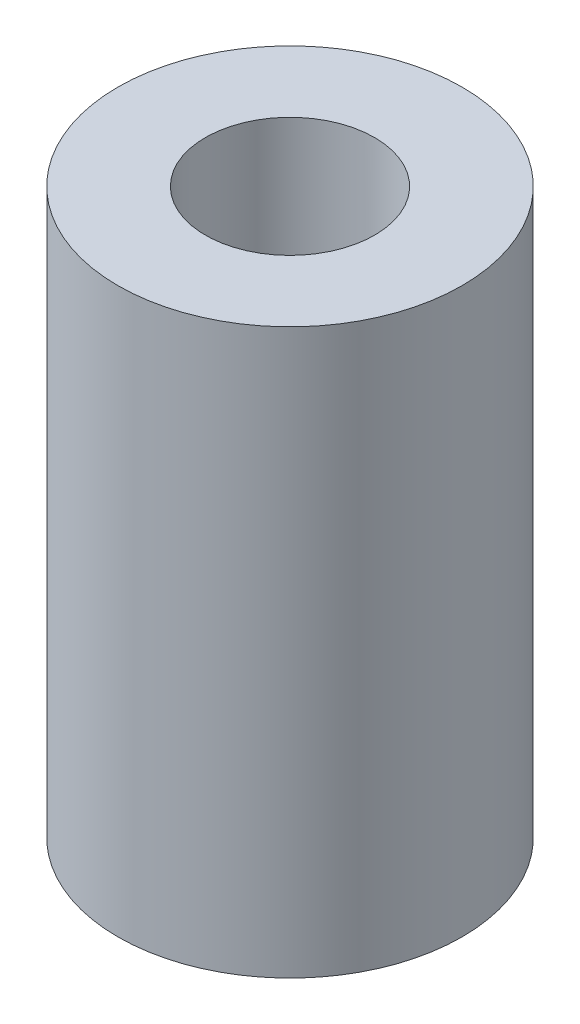
ISO-10303-21;
HEADER;
FILE_DESCRIPTION(('STEP AP214'),'2;1');
FILE_NAME('part.step','',(''),(''),'','','');
FILE_SCHEMA(('AUTOMOTIVE_DESIGN { 1 0 10303 214 1 1 1 1 }'));
ENDSEC;
DATA;
#1=APPLICATION_CONTEXT('core data for automotive mechanical design processes');
#2=APPLICATION_PROTOCOL_DEFINITION('international standard','automotive_design',2000,#1);
#3=PRODUCT_CONTEXT('',#1,'mechanical');
#4=PRODUCT('Part','Part','',(#3));
#5=PRODUCT_RELATED_PRODUCT_CATEGORY('part','',(#4));
#6=PRODUCT_DEFINITION_FORMATION('','',#4);
#7=PRODUCT_DEFINITION_CONTEXT('part definition',#1,'design');
#8=PRODUCT_DEFINITION('design','',#6,#7);
#9=PRODUCT_DEFINITION_SHAPE('','',#8);
#10=(LENGTH_UNIT() NAMED_UNIT(*) SI_UNIT(.MILLI.,.METRE.));
#11=(NAMED_UNIT(*) PLANE_ANGLE_UNIT() SI_UNIT($,.RADIAN.));
#12=(NAMED_UNIT(*) SI_UNIT($,.STERADIAN.) SOLID_ANGLE_UNIT());
#13=UNCERTAINTY_MEASURE_WITH_UNIT(LENGTH_MEASURE(1.E-05),#10,'distance_accuracy_value','');
#14=(GEOMETRIC_REPRESENTATION_CONTEXT(3) GLOBAL_UNCERTAINTY_ASSIGNED_CONTEXT((#13)) GLOBAL_UNIT_ASSIGNED_CONTEXT((#10,
#11,#12)) REPRESENTATION_CONTEXT('',''));
#15=CARTESIAN_POINT('',(0.,0.,0.));
#16=DIRECTION('',(0.,0.,1.));
#17=DIRECTION('',(1.,0.,0.));
#18=AXIS2_PLACEMENT_3D('',#15,#16,#17);
#19=CARTESIAN_POINT('',(0.,20.,0.));
#20=DIRECTION('',(0.,-1.,0.));
#21=DIRECTION('',(0.,0.,-1.));
#22=AXIS2_PLACEMENT_3D('',#19,#20,#21);
#23=CYLINDRICAL_SURFACE('',#22,6.1);
#24=CARTESIAN_POINT('',(0.,6.3,-6.1));
#25=CARTESIAN_POINT('',(-0.0721472378782819,6.29999747414124,-6.09999866499073));
#26=CARTESIAN_POINT('',(-0.144325421720829,6.29397368956464,-6.09870697970158));
#27=CARTESIAN_POINT('',(-0.286634677518991,6.27006090500707,-6.09367889878808));
#28=CARTESIAN_POINT('',(-0.356764196177542,6.25216313406809,-6.08994069602218));
#29=CARTESIAN_POINT('',(-0.492898611459338,6.20508596200381,-6.08043617217222));
#30=CARTESIAN_POINT('',(-0.558907627717589,6.17591804549919,-6.07467191623631));
#31=CARTESIAN_POINT('',(-0.685091975507441,6.10716429797271,-6.06173879644781));
#32=CARTESIAN_POINT('',(-0.7452675179066,6.06757884371478,-6.05456998339528));
#33=CARTESIAN_POINT('',(-0.858999067539796,5.97847337434002,-6.03949176017704));
#34=CARTESIAN_POINT('',(-0.912453172782329,5.92882477115704,-6.03157355461076));
#35=CARTESIAN_POINT('',(-1.01034127282406,5.82127851723689,-6.01595156565194));
#36=CARTESIAN_POINT('',(-1.05477449529856,5.76338016091701,-6.00824780066747));
#37=CARTESIAN_POINT('',(-1.13380424221561,5.64023077676226,-5.99384049277182));
#38=CARTESIAN_POINT('',(-1.16829319858967,5.574909280463,-5.98714823507651));
#39=CARTESIAN_POINT('',(-1.22576567653375,5.43923178605741,-5.97564751297079));
#40=CARTESIAN_POINT('',(-1.24875049921197,5.36887635831381,-5.97083883554236));
#41=CARTESIAN_POINT('',(-1.28222730924954,5.22623080046903,-5.96373913399102));
#42=CARTESIAN_POINT('',(-1.29289922137112,5.15398473685776,-5.96141188874191));
#43=CARTESIAN_POINT('',(-1.30200654741183,5.00869301646272,-5.95942969527498));
#44=CARTESIAN_POINT('',(-1.30044338672555,4.93564745381127,-5.95977443576889));
#45=CARTESIAN_POINT('',(-1.28526994127058,4.79216122534269,-5.96306443370536));
#46=CARTESIAN_POINT('',(-1.27186781368162,4.72169736152983,-5.96596475573787));
#47=CARTESIAN_POINT('',(-1.23372628026949,4.58404171025273,-5.97396816893495));
#48=CARTESIAN_POINT('',(-1.20898626738606,4.51685009820662,-5.97907137804704));
#49=CARTESIAN_POINT('',(-1.14867776853745,4.38705656836288,-5.99095035431158));
#50=CARTESIAN_POINT('',(-1.11302848507777,4.32449337569982,-5.9977385274746));
#51=CARTESIAN_POINT('',(-1.03197026854739,4.2061597124686,-6.01221485911777));
#52=CARTESIAN_POINT('',(-0.986560069137488,4.15039012474573,-6.01990313431431));
#53=CARTESIAN_POINT('',(-0.88616327380492,4.04602749363435,-6.03550677587744));
#54=CARTESIAN_POINT('',(-0.830999468532951,3.99760497818666,-6.04342356687967));
#55=CARTESIAN_POINT('',(-0.713245749892562,3.91067164015609,-6.05844846626327));
#56=CARTESIAN_POINT('',(-0.650655714917737,3.8721609799151,-6.0655565613983));
#57=CARTESIAN_POINT('',(-0.519623880216963,3.80610568362808,-6.0781844463923));
#58=CARTESIAN_POINT('',(-0.451170941082771,3.7785825112957,-6.08370112169056));
#59=CARTESIAN_POINT('',(-0.310468411690469,3.73547591722888,-6.09250130348493));
#60=CARTESIAN_POINT('',(-0.238219346433362,3.71989084908502,-6.09578511791264));
#61=CARTESIAN_POINT('',(-0.0934390069260598,3.70134885638428,-6.09970604249875));
#62=CARTESIAN_POINT('',(-0.0209388664054238,3.69815885945672,-6.10039199556743));
#63=CARTESIAN_POINT('',(0.123558370163738,3.70386707648339,-6.09917640817286));
#64=CARTESIAN_POINT('',(0.195555498218299,3.71276451415749,-6.09727503387314));
#65=CARTESIAN_POINT('',(0.336237004500441,3.74220164153761,-6.09112917603401));
#66=CARTESIAN_POINT('',(0.404947953819974,3.76261990259895,-6.08690914296763));
#67=CARTESIAN_POINT('',(0.537970111559267,3.81438494219114,-6.07659797971405));
#68=CARTESIAN_POINT('',(0.602280957973777,3.84573261861659,-6.0705066958011));
#69=CARTESIAN_POINT('',(0.725647062342393,3.91895797891196,-6.05700780642423));
#70=CARTESIAN_POINT('',(0.784618541602751,3.96097363573498,-6.04958335870804));
#71=CARTESIAN_POINT('',(0.894757591816227,4.05415966778367,-6.03427760561893));
#72=CARTESIAN_POINT('',(0.945924202667638,4.10533116761903,-6.02639624420389));
#73=CARTESIAN_POINT('',(1.03991584010957,4.21644331923712,-6.0108974793882));
#74=CARTESIAN_POINT('',(1.08257988589824,4.27652130038129,-6.00328707342368));
#75=CARTESIAN_POINT('',(1.15721286888981,4.40312707384968,-5.98934935146072));
#76=CARTESIAN_POINT('',(1.18918226004855,4.46965459225583,-5.98302198100577));
#77=CARTESIAN_POINT('',(1.2413083288424,4.60691935485316,-5.97242512335905));
#78=CARTESIAN_POINT('',(1.26153006139007,4.67763097881248,-5.96814432670535));
#79=CARTESIAN_POINT('',(1.28977963235359,4.82155084345584,-5.96210373709314));
#80=CARTESIAN_POINT('',(1.29780930778773,4.89475870632325,-5.96034356434602));
#81=CARTESIAN_POINT('',(1.30137175266486,5.0399720198093,-5.95956658037573));
#82=CARTESIAN_POINT('',(1.29715948120639,5.11197103450369,-5.9604937986198));
#83=CARTESIAN_POINT('',(1.27692533841887,5.25420834965256,-5.96486101184475));
#84=CARTESIAN_POINT('',(1.26090359192536,5.32444666871087,-5.96830098026386));
#85=CARTESIAN_POINT('',(1.21762562172991,5.46097868148835,-5.97727949831446));
#86=CARTESIAN_POINT('',(1.19040470710358,5.52728403011771,-5.98281144789314));
#87=CARTESIAN_POINT('',(1.12553212526249,5.65442515100395,-5.99535354484781));
#88=CARTESIAN_POINT('',(1.0878794354365,5.71526038625902,-6.0023638371274));
#89=CARTESIAN_POINT('',(1.00235871523268,5.83099520267769,-6.01724118782892));
#90=CARTESIAN_POINT('',(0.954308224360551,5.88575819839127,-6.02512212570282));
#91=CARTESIAN_POINT('',(0.849727848108052,5.98652753019339,-6.04075761208133));
#92=CARTESIAN_POINT('',(0.793196010044681,6.03253184419857,-6.04851213102317));
#93=CARTESIAN_POINT('',(0.672428511828421,6.11501223139328,-6.06313289380839));
#94=CARTESIAN_POINT('',(0.60810740895832,6.15136543114871,-6.06998716860474));
#95=CARTESIAN_POINT('',(0.474137023774669,6.21268765641489,-6.0819158518792));
#96=CARTESIAN_POINT('',(0.404492374155826,6.23766645144142,-6.08699178691193));
#97=CARTESIAN_POINT('',(0.278958600183656,6.27095911616882,-6.09386119356624));
#98=CARTESIAN_POINT('',(0.223760106794381,6.28182909640035,-6.09614923274975));
#99=CARTESIAN_POINT('',(0.112380641648211,6.29635037703821,-6.0992191256608));
#100=CARTESIAN_POINT('',(0.0561997094654065,6.30000196753934,-6.10000103991692));
#101=CARTESIAN_POINT('',(0.,6.3,-6.1));
#102=B_SPLINE_CURVE_WITH_KNOTS('',3,(#24,#25,#26,#27,#28,#29,#30,#31,#32,#33,#34,#35,#36,#37,
#38,#39,#40,#41,#42,#43,#44,#45,#46,#47,#48,#49,#50,#51,#52,#53,#54,#55,#56,#57,#58,#59,#60,#61,
#62,#63,#64,#65,#66,#67,#68,#69,#70,#71,#72,#73,#74,#75,#76,#77,#78,#79,#80,#81,#82,#83,#84,#85,
#86,#87,#88,#89,#90,#91,#92,#93,#94,#95,#96,#97,#98,#99,#100,#101),.UNSPECIFIED.,.T.,.F.,(4,2,2,
2,2,2,2,2,2,2,2,2,2,2,2,2,2,2,2,2,2,2,2,2,2,2,2,2,2,2,2,2,2,2,2,2,2,2,4),(0.,0.216236037159647,
0.432631979507759,0.648807986921421,0.864976177120325,1.08410378017079,1.30325013597117,
1.52468499055335,1.74609479537053,1.96422650931674,2.182332811143,2.39667895741157,
2.61103658167883,2.82702189004419,3.04303523634417,3.26347620823797,3.48392079040723,
3.70479392131814,3.92563658565733,4.14230591799764,4.35896133604161,4.57337476950304,
4.78780582202649,5.00516561237281,5.2225521193135,5.44372858167366,5.6648956545682,
5.88482600142272,6.10472320734192,6.32007371501307,6.53542194629087,6.75009636182069,
6.96479182901139,7.18361449895641,7.40248762655717,7.6240265180796,7.84537476849896,
8.01382045312456,8.18225936806715),.UNSPECIFIED.);
#103=CARTESIAN_POINT('',(0.,6.3,-6.1));
#104=VERTEX_POINT('',#103);
#105=EDGE_CURVE('E87',#104,#104,#102,.T.);
#106=ORIENTED_EDGE('',*,*,#105,.T.);
#107=EDGE_LOOP('',(#106));
#108=FACE_BOUND('',#107,.T.);
#109=CARTESIAN_POINT('',(0.,16.3,-6.1));
#110=CARTESIAN_POINT('',(-0.072147237878282,16.2999974741412,-6.09999866499073));
#111=CARTESIAN_POINT('',(-0.144325421720829,16.2939736895646,-6.09870697970158));
#112=CARTESIAN_POINT('',(-0.286634677518991,16.2700609050071,-6.09367889878808));
#113=CARTESIAN_POINT('',(-0.356764196177542,16.2521631340681,-6.08994069602218));
#114=CARTESIAN_POINT('',(-0.492898611459338,16.2050859620038,-6.08043617217222));
#115=CARTESIAN_POINT('',(-0.558907627717589,16.1759180454992,-6.07467191623631));
#116=CARTESIAN_POINT('',(-0.685091975507441,16.1071642979727,-6.06173879644781));
#117=CARTESIAN_POINT('',(-0.7452675179066,16.0675788437148,-6.05456998339528));
#118=CARTESIAN_POINT('',(-0.858999067539797,15.97847337434,-6.03949176017704));
#119=CARTESIAN_POINT('',(-0.912453172782331,15.928824771157,-6.03157355461076));
#120=CARTESIAN_POINT('',(-1.01034127282406,15.8212785172369,-6.01595156565194));
#121=CARTESIAN_POINT('',(-1.05477449529856,15.763380160917,-6.00824780066747));
#122=CARTESIAN_POINT('',(-1.13380424221561,15.6402307767623,-5.99384049277182));
#123=CARTESIAN_POINT('',(-1.16829319858967,15.574909280463,-5.98714823507651));
#124=CARTESIAN_POINT('',(-1.22576567653375,15.4392317860574,-5.97564751297079));
#125=CARTESIAN_POINT('',(-1.24875049921197,15.3688763583138,-5.97083883554236));
#126=CARTESIAN_POINT('',(-1.28222730924954,15.226230800469,-5.96373913399102));
#127=CARTESIAN_POINT('',(-1.29289922137112,15.1539847368578,-5.96141188874191));
#128=CARTESIAN_POINT('',(-1.30200654741183,15.0086930164627,-5.95942969527498));
#129=CARTESIAN_POINT('',(-1.30044338672556,14.9356474538113,-5.95977443576889));
#130=CARTESIAN_POINT('',(-1.28526994127059,14.7921612253427,-5.96306443370536));
#131=CARTESIAN_POINT('',(-1.27186781368162,14.7216973615298,-5.96596475573787));
#132=CARTESIAN_POINT('',(-1.23372628026949,14.5840417102527,-5.97396816893495));
#133=CARTESIAN_POINT('',(-1.20898626738606,14.5168500982066,-5.97907137804704));
#134=CARTESIAN_POINT('',(-1.14867776853745,14.3870565683629,-5.99095035431158));
#135=CARTESIAN_POINT('',(-1.11302848507777,14.3244933756998,-5.9977385274746));
#136=CARTESIAN_POINT('',(-1.03197026854739,14.2061597124686,-6.01221485911777));
#137=CARTESIAN_POINT('',(-0.98656006913749,14.1503901247457,-6.0199031343143));
#138=CARTESIAN_POINT('',(-0.886163273804922,14.0460274936344,-6.03550677587744));
#139=CARTESIAN_POINT('',(-0.830999468532953,13.9976049781867,-6.04342356687967));
#140=CARTESIAN_POINT('',(-0.713245749892564,13.9106716401561,-6.05844846626327));
#141=CARTESIAN_POINT('',(-0.650655714917739,13.8721609799151,-6.0655565613983));
#142=CARTESIAN_POINT('',(-0.519623880216966,13.8061056836281,-6.0781844463923));
#143=CARTESIAN_POINT('',(-0.451170941082773,13.7785825112957,-6.08370112169056));
#144=CARTESIAN_POINT('',(-0.310468411690472,13.7354759172289,-6.09250130348493));
#145=CARTESIAN_POINT('',(-0.238219346433365,13.719890849085,-6.09578511791264));
#146=CARTESIAN_POINT('',(-0.0934390069260622,13.7013488563843,-6.09970604249875));
#147=CARTESIAN_POINT('',(-0.0209388664054261,13.6981588594567,-6.10039199556743));
#148=CARTESIAN_POINT('',(0.123558370163735,13.7038670764834,-6.09917640817286));
#149=CARTESIAN_POINT('',(0.195555498218297,13.7127645141575,-6.09727503387314));
#150=CARTESIAN_POINT('',(0.336237004500438,13.7422016415376,-6.09112917603401));
#151=CARTESIAN_POINT('',(0.404947953819971,13.762619902599,-6.08690914296763));
#152=CARTESIAN_POINT('',(0.537970111559264,13.8143849421911,-6.07659797971405));
#153=CARTESIAN_POINT('',(0.602280957973774,13.8457326186166,-6.0705066958011));
#154=CARTESIAN_POINT('',(0.725647062342391,13.918957978912,-6.05700780642423));
#155=CARTESIAN_POINT('',(0.784618541602748,13.960973635735,-6.04958335870805));
#156=CARTESIAN_POINT('',(0.894757591816225,14.0541596677837,-6.03427760561893));
#157=CARTESIAN_POINT('',(0.945924202667636,14.105331167619,-6.02639624420389));
#158=CARTESIAN_POINT('',(1.03991584010957,14.2164433192371,-6.0108974793882));
#159=CARTESIAN_POINT('',(1.08257988589824,14.2765213003813,-6.00328707342368));
#160=CARTESIAN_POINT('',(1.15721286888981,14.4031270738497,-5.98934935146072));
#161=CARTESIAN_POINT('',(1.18918226004855,14.4696545922558,-5.98302198100577));
#162=CARTESIAN_POINT('',(1.2413083288424,14.6069193548532,-5.97242512335905));
#163=CARTESIAN_POINT('',(1.26153006139007,14.6776309788125,-5.96814432670535));
#164=CARTESIAN_POINT('',(1.28977963235359,14.8215508434558,-5.96210373709314));
#165=CARTESIAN_POINT('',(1.29780930778773,14.8947587063232,-5.96034356434602));
#166=CARTESIAN_POINT('',(1.30137175266485,15.0399720198093,-5.95956658037573));
#167=CARTESIAN_POINT('',(1.29715948120639,15.1119710345037,-5.9604937986198));
#168=CARTESIAN_POINT('',(1.27692533841887,15.2542083496526,-5.96486101184475));
#169=CARTESIAN_POINT('',(1.26090359192536,15.3244466687109,-5.96830098026386));
#170=CARTESIAN_POINT('',(1.21762562172991,15.4609786814884,-5.97727949831446));
#171=CARTESIAN_POINT('',(1.19040470710357,15.5272840301177,-5.98281144789314));
#172=CARTESIAN_POINT('',(1.12553212526249,15.6544251510039,-5.99535354484781));
#173=CARTESIAN_POINT('',(1.0878794354365,15.715260386259,-6.0023638371274));
#174=CARTESIAN_POINT('',(1.00235871523268,15.8309952026777,-6.01724118782892));
#175=CARTESIAN_POINT('',(0.954308224360552,15.8857581983913,-6.02512212570282));
#176=CARTESIAN_POINT('',(0.849727848108053,15.9865275301934,-6.04075761208133));
#177=CARTESIAN_POINT('',(0.79319601004468,16.0325318441986,-6.04851213102317));
#178=CARTESIAN_POINT('',(0.672428511828419,16.1150122313933,-6.06313289380839));
#179=CARTESIAN_POINT('',(0.608107408958318,16.1513654311487,-6.06998716860474));
#180=CARTESIAN_POINT('',(0.474137023774668,16.2126876564149,-6.0819158518792));
#181=CARTESIAN_POINT('',(0.404492374155825,16.2376664514414,-6.08699178691193));
#182=CARTESIAN_POINT('',(0.278958600183655,16.2709591161688,-6.09386119356624));
#183=CARTESIAN_POINT('',(0.223760106794381,16.2818290964004,-6.09614923274975));
#184=CARTESIAN_POINT('',(0.112380641648211,16.2963503770382,-6.0992191256608));
#185=CARTESIAN_POINT('',(0.0561997094654064,16.3000019675393,-6.10000103991692));
#186=CARTESIAN_POINT('',(0.,16.3,-6.1));
#187=B_SPLINE_CURVE_WITH_KNOTS('',3,(#109,#110,#111,#112,#113,#114,#115,#116,#117,#118,#119,
#120,#121,#122,#123,#124,#125,#126,#127,#128,#129,#130,#131,#132,#133,#134,#135,#136,#137,#138,
#139,#140,#141,#142,#143,#144,#145,#146,#147,#148,#149,#150,#151,#152,#153,#154,#155,#156,#157,
#158,#159,#160,#161,#162,#163,#164,#165,#166,#167,#168,#169,#170,#171,#172,#173,#174,#175,#176,
#177,#178,#179,#180,#181,#182,#183,#184,#185,#186),.UNSPECIFIED.,.T.,.F.,(4,2,2,2,2,2,2,2,2,2,2,
2,2,2,2,2,2,2,2,2,2,2,2,2,2,2,2,2,2,2,2,2,2,2,2,2,2,2,4),(0.,0.216236037159647,
0.432631979507759,0.64880798692142,0.864976177120326,1.08410378017079,1.30325013597117,
1.52468499055335,1.74609479537053,1.96422650931674,2.182332811143,2.39667895741157,
2.61103658167883,2.82702189004419,3.04303523634417,3.26347620823797,3.48392079040723,
3.70479392131814,3.92563658565733,4.14230591799764,4.35896133604161,4.57337476950304,
4.78780582202649,5.00516561237281,5.22255211931351,5.44372858167366,5.6648956545682,
5.88482600142272,6.10472320734191,6.32007371501307,6.53542194629087,6.75009636182069,
6.96479182901138,7.18361449895641,7.40248762655717,7.6240265180796,7.84537476849897,
8.01382045312456,8.18225936806715),.UNSPECIFIED.);
#188=CARTESIAN_POINT('',(0.,16.3,-6.1));
#189=VERTEX_POINT('',#188);
#190=EDGE_CURVE('E66',#189,#189,#187,.T.);
#191=ORIENTED_EDGE('',*,*,#190,.T.);
#192=EDGE_LOOP('',(#191));
#193=FACE_BOUND('',#192,.T.);
#194=CARTESIAN_POINT('',(0.,20.,0.));
#195=DIRECTION('',(0.,1.,0.));
#196=DIRECTION('',(0.,0.,1.));
#197=AXIS2_PLACEMENT_3D('',#194,#195,#196);
#198=CIRCLE('',#197,6.1);
#199=CARTESIAN_POINT('',(0.,20.,6.1));
#200=VERTEX_POINT('',#199);
#201=EDGE_CURVE('E10',#200,#200,#198,.T.);
#202=ORIENTED_EDGE('',*,*,#201,.F.);
#203=EDGE_LOOP('',(#202));
#204=FACE_BOUND('',#203,.T.);
#205=CARTESIAN_POINT('',(0.,0.,0.));
#206=DIRECTION('',(0.,1.,0.));
#207=DIRECTION('',(0.,0.,1.));
#208=AXIS2_PLACEMENT_3D('',#205,#206,#207);
#209=CIRCLE('',#208,6.1);
#210=CARTESIAN_POINT('',(0.,0.,6.1));
#211=VERTEX_POINT('',#210);
#212=EDGE_CURVE('E44',#211,#211,#209,.T.);
#213=ORIENTED_EDGE('',*,*,#212,.T.);
#214=EDGE_LOOP('',(#213));
#215=FACE_BOUND('',#214,.T.);
#216=ADVANCED_FACE('F41',(#108,#193,#204,#215),#23,.T.);
#217=CARTESIAN_POINT('',(0.,20.,0.));
#218=DIRECTION('',(0.,1.,0.));
#219=DIRECTION('',(0.,0.,1.));
#220=AXIS2_PLACEMENT_3D('',#217,#218,#219);
#221=PLANE('',#220);
#222=CARTESIAN_POINT('',(0.,20.,0.));
#223=DIRECTION('',(0.,-1.,0.));
#224=DIRECTION('',(0.,0.,-1.));
#225=AXIS2_PLACEMENT_3D('',#222,#223,#224);
#226=CIRCLE('',#225,3.);
#227=CARTESIAN_POINT('',(0.,20.,-3.));
#228=VERTEX_POINT('',#227);
#229=EDGE_CURVE('E51',#228,#228,#226,.T.);
#230=ORIENTED_EDGE('',*,*,#229,.T.);
#231=EDGE_LOOP('',(#230));
#232=FACE_BOUND('',#231,.T.);
#233=ORIENTED_EDGE('',*,*,#201,.T.);
#234=EDGE_LOOP('',(#233));
#235=FACE_BOUND('',#234,.T.);
#236=ADVANCED_FACE('F115',(#232,#235),#221,.T.);
#237=CARTESIAN_POINT('',(0.,0.,0.));
#238=DIRECTION('',(0.,1.,0.));
#239=DIRECTION('',(0.,0.,1.));
#240=AXIS2_PLACEMENT_3D('',#237,#238,#239);
#241=PLANE('',#240);
#242=CARTESIAN_POINT('',(0.,0.,0.));
#243=DIRECTION('',(0.,-1.,0.));
#244=DIRECTION('',(0.,0.,-1.));
#245=AXIS2_PLACEMENT_3D('',#242,#243,#244);
#246=CIRCLE('',#245,3.);
#247=CARTESIAN_POINT('',(0.,0.,-3.));
#248=VERTEX_POINT('',#247);
#249=EDGE_CURVE('E53',#248,#248,#246,.T.);
#250=ORIENTED_EDGE('',*,*,#249,.F.);
#251=EDGE_LOOP('',(#250));
#252=FACE_BOUND('',#251,.T.);
#253=ORIENTED_EDGE('',*,*,#212,.F.);
#254=EDGE_LOOP('',(#253));
#255=FACE_BOUND('',#254,.T.);
#256=ADVANCED_FACE('F108',(#252,#255),#241,.F.);
#257=CARTESIAN_POINT('',(0.,20.,0.));
#258=DIRECTION('',(0.,-1.,0.));
#259=DIRECTION('',(0.,0.,-1.));
#260=AXIS2_PLACEMENT_3D('',#257,#258,#259);
#261=CYLINDRICAL_SURFACE('',#260,3.);
#262=CARTESIAN_POINT('',(0.,6.3,-3.));
#263=CARTESIAN_POINT('',(0.0693958855683926,6.29999187949843,-2.9999938036117));
#264=CARTESIAN_POINT('',(0.138888013952175,6.29441081956174,-2.99756468506242));
#265=CARTESIAN_POINT('',(0.275891766508392,6.27229092229464,-2.98808130029361));
#266=CARTESIAN_POINT('',(0.343398022712461,6.25572480813832,-2.98101552130597));
#267=CARTESIAN_POINT('',(0.474219415336769,6.21237198830799,-2.96301524785297));
#268=CARTESIAN_POINT('',(0.537548310263574,6.1856210257447,-2.952094292546));
#269=CARTESIAN_POINT('',(0.658753819296256,6.12281160543008,-2.92743470321447));
#270=CARTESIAN_POINT('',(0.716631835141345,6.08675554953107,-2.91369679649568));
#271=CARTESIAN_POINT('',(0.828479596726982,6.00433067834176,-2.88394396121801));
#272=CARTESIAN_POINT('',(0.882120533413547,5.95754428632668,-2.86785060527783));
#273=CARTESIAN_POINT('',(0.981081610537496,5.85587176491351,-2.83552363956781));
#274=CARTESIAN_POINT('',(1.02639703185042,5.80098107337811,-2.81928995568102));
#275=CARTESIAN_POINT('',(1.10985592300126,5.6810573482872,-2.78752992624893));
#276=CARTESIAN_POINT('',(1.14747735663465,5.61563578089421,-2.77208964718584));
#277=CARTESIAN_POINT('',(1.21103519863867,5.47863042763041,-2.74492209080657));
#278=CARTESIAN_POINT('',(1.23697810640567,5.40705009575604,-2.73319274934222));
#279=CARTESIAN_POINT('',(1.27505690972942,5.26354315709036,-2.71563104347921));
#280=CARTESIAN_POINT('',(1.28782815700269,5.19181948179876,-2.70952900075929));
#281=CARTESIAN_POINT('',(1.30117967379442,5.04700778018237,-2.70314487124142));
#282=CARTESIAN_POINT('',(1.30176748376291,4.97392062576855,-2.70285918464501));
#283=CARTESIAN_POINT('',(1.29121114224913,4.83503458633818,-2.70791373893279));
#284=CARTESIAN_POINT('',(1.28105067041771,4.76914019749452,-2.71278229453471));
#285=CARTESIAN_POINT('',(1.25094634955397,4.64010512277579,-2.72679407699973));
#286=CARTESIAN_POINT('',(1.2310004400156,4.57696501991738,-2.73593820414497));
#287=CARTESIAN_POINT('',(1.18149733559894,4.45357291517493,-2.7576812413234));
#288=CARTESIAN_POINT('',(1.15173810621167,4.3934151671214,-2.77035181471973));
#289=CARTESIAN_POINT('',(1.08359731126374,4.27870096198399,-2.7977066951671));
#290=CARTESIAN_POINT('',(1.0452122005779,4.22414682138046,-2.81239182920703));
#291=CARTESIAN_POINT('',(0.956763500045269,4.11689853971858,-2.84376495885929));
#292=CARTESIAN_POINT('',(0.905949840019158,4.06483866328706,-2.86051284042277));
#293=CARTESIAN_POINT('',(0.796161781955164,3.96975653696322,-2.89299183289078));
#294=CARTESIAN_POINT('',(0.737185158410779,3.92673675979704,-2.90872266479059));
#295=CARTESIAN_POINT('',(0.610683408461491,3.84992027399584,-2.93792192262276));
#296=CARTESIAN_POINT('',(0.54297147733353,3.8164017795694,-2.95131838053739));
#297=CARTESIAN_POINT('',(0.402140539303132,3.76145799203149,-2.97377767716935));
#298=CARTESIAN_POINT('',(0.329024800278674,3.74002545669931,-2.98284311065036));
#299=CARTESIAN_POINT('',(0.184744596259868,3.71123622205537,-2.99512193045236));
#300=CARTESIAN_POINT('',(0.113779769787295,3.70302958133014,-2.99868798029419));
#301=CARTESIAN_POINT('',(-0.0285977930543543,3.69836617150185,-3.00070732544717));
#302=CARTESIAN_POINT('',(-0.100010379947169,3.7019056699934,-2.99916224485085));
#303=CARTESIAN_POINT('',(-0.237141828874884,3.72004411064509,-2.99135879250282));
#304=CARTESIAN_POINT('',(-0.302958647928947,3.73402850309611,-2.9853624375295));
#305=CARTESIAN_POINT('',(-0.431228822019107,3.77178450321915,-2.96954887667738));
#306=CARTESIAN_POINT('',(-0.493681760247146,3.79555732060434,-2.9597311985444));
#307=CARTESIAN_POINT('',(-0.615662129119877,3.85298344302988,-2.93682372498151));
#308=CARTESIAN_POINT('',(-0.675037155504065,3.88692228900204,-2.92364126620662));
#309=CARTESIAN_POINT('',(-0.78746359582105,3.96340528106302,-2.89538713698056));
#310=CARTESIAN_POINT('',(-0.840512275303471,4.0059531269655,-2.88031465533363));
#311=CARTESIAN_POINT('',(-0.94307851442406,4.10226704367519,-2.84845657560699));
#312=CARTESIAN_POINT('',(-0.992010281565088,4.15664440047071,-2.83162839963577));
#313=CARTESIAN_POINT('',(-1.08023746136902,4.27307241084018,-2.79916100321518));
#314=CARTESIAN_POINT('',(-1.11952998329259,4.33512535789594,-2.78352214039997));
#315=CARTESIAN_POINT('',(-1.18799396546213,4.46681991449319,-2.75500961120659));
#316=CARTESIAN_POINT('',(-1.21695271228868,4.53658608983543,-2.7421959320898));
#317=CARTESIAN_POINT('',(-1.26244643523488,4.68073908114005,-2.72155551226023));
#318=CARTESIAN_POINT('',(-1.27899278995767,4.75512159733388,-2.71372420514452));
#319=CARTESIAN_POINT('',(-1.29801913363522,4.89984529680744,-2.704671360909));
#320=CARTESIAN_POINT('',(-1.30153856077072,4.9700196894986,-2.70296176853372));
#321=CARTESIAN_POINT('',(-1.29723195002844,5.10992925171052,-2.70503155911719));
#322=CARTESIAN_POINT('',(-1.28940802913306,5.17966450074838,-2.70880991787275));
#323=CARTESIAN_POINT('',(-1.26353261784872,5.31278628177086,-2.72096867762109));
#324=CARTESIAN_POINT('',(-1.24606085878846,5.37631179012861,-2.7290874565112));
#325=CARTESIAN_POINT('',(-1.20197886082053,5.4995315365118,-2.74878635824563));
#326=CARTESIAN_POINT('',(-1.17536601115756,5.55922467419977,-2.76036746983222));
#327=CARTESIAN_POINT('',(-1.11184459478116,5.67717506451443,-2.78658408158999));
#328=CARTESIAN_POINT('',(-1.07439549805272,5.73510811405998,-2.80136547372569));
#329=CARTESIAN_POINT('',(-0.990988677732637,5.84419179701374,-2.83194511643092));
#330=CARTESIAN_POINT('',(-0.945027633519294,5.89533977006407,-2.84774376226991));
#331=CARTESIAN_POINT('',(-0.841469692725584,5.99369653751069,-2.88012186166299));
#332=CARTESIAN_POINT('',(-0.783230080750298,6.04024550343784,-2.89666015162146));
#333=CARTESIAN_POINT('',(-0.659171627840692,6.12296445129461,-2.92738288634079));
#334=CARTESIAN_POINT('',(-0.593349367795089,6.15912972521575,-2.94156626214873));
#335=CARTESIAN_POINT('',(-0.45677303144877,6.21936642647467,-2.9658226554285));
#336=CARTESIAN_POINT('',(-0.386098709365476,6.2435964781741,-2.97594923106036));
#337=CARTESIAN_POINT('',(-0.241263639342714,6.27957942863026,-2.99116202261119));
#338=CARTESIAN_POINT('',(-0.167114389936306,6.29137080961747,-2.99626378082808));
#339=CARTESIAN_POINT('',(-0.0617461862231585,6.29890354231888,-2.99952567069647));
#340=CARTESIAN_POINT('',(-0.0308826232508099,6.30000361379336,-3.00000275752264));
#341=CARTESIAN_POINT('',(0.,6.3,-3.));
#342=B_SPLINE_CURVE_WITH_KNOTS('',3,(#262,#263,#264,#265,#266,#267,#268,#269,#270,#271,#272,
#273,#274,#275,#276,#277,#278,#279,#280,#281,#282,#283,#284,#285,#286,#287,#288,#289,#290,#291,
#292,#293,#294,#295,#296,#297,#298,#299,#300,#301,#302,#303,#304,#305,#306,#307,#308,#309,#310,
#311,#312,#313,#314,#315,#316,#317,#318,#319,#320,#321,#322,#323,#324,#325,#326,#327,#328,#329,
#330,#331,#332,#333,#334,#335,#336,#337,#338,#339,#340,#341),.UNSPECIFIED.,.T.,.F.,(4,2,2,2,2,2,
2,2,2,2,2,2,2,2,2,2,2,2,2,2,2,2,2,2,2,2,2,2,2,2,2,2,2,2,2,2,2,2,2,4),(0.,0.208094615549781,
0.416707892429055,0.624595703123544,0.832429906910864,1.05041190886923,1.26851709019195,
1.49844711043433,1.72824901010107,1.94635835717652,2.16433271018304,2.36395332552962,
2.56361599276524,2.76767672691135,2.97182148125119,3.19477153415354,3.41778249113072,
3.64677280035965,3.8756257464359,4.0890827822016,4.30247199722338,4.50420732225222,
4.70596758644839,4.91403265063408,5.12218732375193,5.34635870776666,5.57059723718663,
5.79921633968279,6.02762560706569,6.23736054503839,6.44705634571025,6.64534095193696,
6.84368223669883,7.05444844547559,7.26529705076158,7.49331345754743,7.72143308523394,
7.94643309239116,8.17073494411884,8.26334140860746),.UNSPECIFIED.);
#343=CARTESIAN_POINT('',(0.,6.3,-3.));
#344=VERTEX_POINT('',#343);
#345=EDGE_CURVE('E92',#344,#344,#342,.T.);
#346=ORIENTED_EDGE('',*,*,#345,.T.);
#347=EDGE_LOOP('',(#346));
#348=FACE_BOUND('',#347,.T.);
#349=CARTESIAN_POINT('',(0.,16.3,-3.));
#350=CARTESIAN_POINT('',(0.0693958855683927,16.2999918794984,-2.9999938036117));
#351=CARTESIAN_POINT('',(0.138888013952175,16.2944108195617,-2.99756468506242));
#352=CARTESIAN_POINT('',(0.275891766508393,16.2722909222946,-2.98808130029361));
#353=CARTESIAN_POINT('',(0.343398022712461,16.2557248081383,-2.98101552130597));
#354=CARTESIAN_POINT('',(0.474219415336769,16.212371988308,-2.96301524785297));
#355=CARTESIAN_POINT('',(0.537548310263574,16.1856210257447,-2.952094292546));
#356=CARTESIAN_POINT('',(0.658753819296256,16.1228116054301,-2.92743470321447));
#357=CARTESIAN_POINT('',(0.716631835141345,16.0867555495311,-2.91369679649568));
#358=CARTESIAN_POINT('',(0.828479596726982,16.0043306783418,-2.88394396121801));
#359=CARTESIAN_POINT('',(0.882120533413546,15.9575442863267,-2.86785060527783));
#360=CARTESIAN_POINT('',(0.981081610537495,15.8558717649135,-2.83552363956781));
#361=CARTESIAN_POINT('',(1.02639703185042,15.8009810733781,-2.81928995568102));
#362=CARTESIAN_POINT('',(1.10985592300126,15.6810573482872,-2.78752992624893));
#363=CARTESIAN_POINT('',(1.14747735663465,15.6156357808942,-2.77208964718584));
#364=CARTESIAN_POINT('',(1.21103519863867,15.4786304276304,-2.74492209080657));
#365=CARTESIAN_POINT('',(1.23697810640567,15.407050095756,-2.73319274934222));
#366=CARTESIAN_POINT('',(1.27505690972942,15.2635431570904,-2.71563104347921));
#367=CARTESIAN_POINT('',(1.28782815700269,15.1918194817988,-2.70952900075929));
#368=CARTESIAN_POINT('',(1.30117967379441,15.0470077801824,-2.70314487124142));
#369=CARTESIAN_POINT('',(1.30176748376291,14.9739206257686,-2.70285918464501));
#370=CARTESIAN_POINT('',(1.29121114224913,14.8350345863382,-2.70791373893279));
#371=CARTESIAN_POINT('',(1.28105067041771,14.7691401974945,-2.71278229453471));
#372=CARTESIAN_POINT('',(1.25094634955396,14.6401051227758,-2.72679407699973));
#373=CARTESIAN_POINT('',(1.2310004400156,14.5769650199174,-2.73593820414497));
#374=CARTESIAN_POINT('',(1.18149733559894,14.4535729151749,-2.75768124132341));
#375=CARTESIAN_POINT('',(1.15173810621167,14.3934151671214,-2.77035181471973));
#376=CARTESIAN_POINT('',(1.08359731126374,14.278700961984,-2.79770669516711));
#377=CARTESIAN_POINT('',(1.0452122005779,14.2241468213805,-2.81239182920704));
#378=CARTESIAN_POINT('',(0.956763500045266,14.1168985397186,-2.84376495885929));
#379=CARTESIAN_POINT('',(0.905949840019155,14.0648386632871,-2.86051284042277));
#380=CARTESIAN_POINT('',(0.79616178195516,13.9697565369632,-2.89299183289078));
#381=CARTESIAN_POINT('',(0.737185158410775,13.926736759797,-2.90872266479059));
#382=CARTESIAN_POINT('',(0.610683408461486,13.8499202739958,-2.93792192262276));
#383=CARTESIAN_POINT('',(0.542971477333526,13.8164017795694,-2.95131838053739));
#384=CARTESIAN_POINT('',(0.402140539303128,13.7614579920315,-2.97377767716935));
#385=CARTESIAN_POINT('',(0.32902480027867,13.7400254566993,-2.98284311065036));
#386=CARTESIAN_POINT('',(0.184744596259865,13.7112362220554,-2.99512193045236));
#387=CARTESIAN_POINT('',(0.113779769787291,13.7030295813301,-2.99868798029419));
#388=CARTESIAN_POINT('',(-0.0285977930543577,13.6983661715019,-3.00070732544717));
#389=CARTESIAN_POINT('',(-0.100010379947173,13.7019056699934,-2.99916224485085));
#390=CARTESIAN_POINT('',(-0.237141828874888,13.7200441106451,-2.99135879250282));
#391=CARTESIAN_POINT('',(-0.302958647928951,13.7340285030961,-2.9853624375295));
#392=CARTESIAN_POINT('',(-0.43122882201911,13.7717845032192,-2.96954887667738));
#393=CARTESIAN_POINT('',(-0.493681760247149,13.7955573206043,-2.9597311985444));
#394=CARTESIAN_POINT('',(-0.61566212911988,13.8529834430299,-2.93682372498151));
#395=CARTESIAN_POINT('',(-0.675037155504069,13.886922289002,-2.92364126620661));
#396=CARTESIAN_POINT('',(-0.787463595821054,13.963405281063,-2.89538713698056));
#397=CARTESIAN_POINT('',(-0.840512275303474,14.0059531269655,-2.88031465533363));
#398=CARTESIAN_POINT('',(-0.943078514424062,14.1022670436752,-2.84845657560699));
#399=CARTESIAN_POINT('',(-0.992010281565089,14.1566444004707,-2.83162839963577));
#400=CARTESIAN_POINT('',(-1.08023746136902,14.2730724108402,-2.79916100321518));
#401=CARTESIAN_POINT('',(-1.11952998329259,14.3351253578959,-2.78352214039997));
#402=CARTESIAN_POINT('',(-1.18799396546213,14.4668199144932,-2.75500961120659));
#403=CARTESIAN_POINT('',(-1.21695271228869,14.5365860898354,-2.7421959320898));
#404=CARTESIAN_POINT('',(-1.26244643523489,14.6807390811401,-2.72155551226023));
#405=CARTESIAN_POINT('',(-1.27899278995767,14.7551215973339,-2.71372420514452));
#406=CARTESIAN_POINT('',(-1.29801913363522,14.8998452968074,-2.704671360909));
#407=CARTESIAN_POINT('',(-1.30153856077072,14.9700196894986,-2.70296176853371));
#408=CARTESIAN_POINT('',(-1.29723195002844,15.1099292517105,-2.70503155911719));
#409=CARTESIAN_POINT('',(-1.28940802913306,15.1796645007484,-2.70880991787275));
#410=CARTESIAN_POINT('',(-1.26353261784873,15.3127862817709,-2.72096867762109));
#411=CARTESIAN_POINT('',(-1.24606085878846,15.3763117901286,-2.7290874565112));
#412=CARTESIAN_POINT('',(-1.20197886082053,15.4995315365118,-2.74878635824563));
#413=CARTESIAN_POINT('',(-1.17536601115756,15.5592246741998,-2.76036746983222));
#414=CARTESIAN_POINT('',(-1.11184459478116,15.6771750645144,-2.78658408158999));
#415=CARTESIAN_POINT('',(-1.07439549805272,15.73510811406,-2.80136547372569));
#416=CARTESIAN_POINT('',(-0.990988677732637,15.8441917970138,-2.83194511643092));
#417=CARTESIAN_POINT('',(-0.945027633519294,15.8953397700641,-2.84774376226991));
#418=CARTESIAN_POINT('',(-0.841469692725584,15.9936965375107,-2.88012186166299));
#419=CARTESIAN_POINT('',(-0.783230080750298,16.0402455034378,-2.89666015162146));
#420=CARTESIAN_POINT('',(-0.659171627840691,16.1229644512946,-2.92738288634079));
#421=CARTESIAN_POINT('',(-0.593349367795088,16.1591297252157,-2.94156626214873));
#422=CARTESIAN_POINT('',(-0.456773031448768,16.2193664264747,-2.9658226554285));
#423=CARTESIAN_POINT('',(-0.386098709365475,16.2435964781741,-2.97594923106036));
#424=CARTESIAN_POINT('',(-0.241263639342713,16.2795794286303,-2.99116202261119));
#425=CARTESIAN_POINT('',(-0.167114389936305,16.2913708096175,-2.99626378082808));
#426=CARTESIAN_POINT('',(-0.0617461862231576,16.2989035423189,-2.99952567069647));
#427=CARTESIAN_POINT('',(-0.0308826232508095,16.3000036137934,-3.00000275752264));
#428=CARTESIAN_POINT('',(0.,16.3,-3.));
#429=B_SPLINE_CURVE_WITH_KNOTS('',3,(#349,#350,#351,#352,#353,#354,#355,#356,#357,#358,#359,
#360,#361,#362,#363,#364,#365,#366,#367,#368,#369,#370,#371,#372,#373,#374,#375,#376,#377,#378,
#379,#380,#381,#382,#383,#384,#385,#386,#387,#388,#389,#390,#391,#392,#393,#394,#395,#396,#397,
#398,#399,#400,#401,#402,#403,#404,#405,#406,#407,#408,#409,#410,#411,#412,#413,#414,#415,#416,
#417,#418,#419,#420,#421,#422,#423,#424,#425,#426,#427,#428),.UNSPECIFIED.,.T.,.F.,(4,2,2,2,2,2,
2,2,2,2,2,2,2,2,2,2,2,2,2,2,2,2,2,2,2,2,2,2,2,2,2,2,2,2,2,2,2,2,2,4),(0.,0.208094615549781,
0.416707892429056,0.624595703123544,0.832429906910864,1.05041190886923,1.26851709019195,
1.49844711043433,1.72824901010107,1.94635835717652,2.16433271018304,2.36395332552962,
2.56361599276525,2.76767672691135,2.97182148125119,3.19477153415355,3.41778249113073,
3.64677280035965,3.8756257464359,4.0890827822016,4.30247199722338,4.50420732225222,
4.7059675864484,4.91403265063409,5.12218732375193,5.34635870776666,5.57059723718663,
5.79921633968279,6.02762560706569,6.23736054503838,6.44705634571025,6.64534095193696,
6.84368223669883,7.05444844547559,7.26529705076158,7.49331345754743,7.72143308523395,
7.94643309239116,8.17073494411884,8.26334140860746),.UNSPECIFIED.);
#430=CARTESIAN_POINT('',(0.,16.3,-3.));
#431=VERTEX_POINT('',#430);
#432=EDGE_CURVE('E56',#431,#431,#429,.T.);
#433=ORIENTED_EDGE('',*,*,#432,.T.);
#434=EDGE_LOOP('',(#433));
#435=FACE_BOUND('',#434,.T.);
#436=ORIENTED_EDGE('',*,*,#229,.F.);
#437=EDGE_LOOP('',(#436));
#438=FACE_BOUND('',#437,.T.);
#439=ORIENTED_EDGE('',*,*,#249,.T.);
#440=EDGE_LOOP('',(#439));
#441=FACE_BOUND('',#440,.T.);
#442=ADVANCED_FACE('F72',(#348,#435,#438,#441),#261,.F.);
#443=CARTESIAN_POINT('',(0.,15.,0.));
#444=DIRECTION('',(0.,0.,1.));
#445=DIRECTION('',(1.,0.,0.));
#446=AXIS2_PLACEMENT_3D('',#443,#444,#445);
#447=CYLINDRICAL_SURFACE('',#446,1.3);
#448=ORIENTED_EDGE('',*,*,#190,.F.);
#449=EDGE_LOOP('',(#448));
#450=FACE_BOUND('',#449,.T.);
#451=ORIENTED_EDGE('',*,*,#432,.F.);
#452=EDGE_LOOP('',(#451));
#453=FACE_BOUND('',#452,.T.);
#454=ADVANCED_FACE('F75',(#450,#453),#447,.F.);
#455=CARTESIAN_POINT('',(0.,5.,0.));
#456=DIRECTION('',(0.,0.,1.));
#457=DIRECTION('',(1.,0.,0.));
#458=AXIS2_PLACEMENT_3D('',#455,#456,#457);
#459=CYLINDRICAL_SURFACE('',#458,1.3);
#460=ORIENTED_EDGE('',*,*,#105,.F.);
#461=EDGE_LOOP('',(#460));
#462=FACE_BOUND('',#461,.T.);
#463=ORIENTED_EDGE('',*,*,#345,.F.);
#464=EDGE_LOOP('',(#463));
#465=FACE_BOUND('',#464,.T.);
#466=ADVANCED_FACE('F79',(#462,#465),#459,.F.);
#467=CLOSED_SHELL('',(#216,#236,#256,#442,#454,#466));
#468=MANIFOLD_SOLID_BREP('B2',#467);
#469=ADVANCED_BREP_SHAPE_REPRESENTATION('',(#18,#468),#14);
#470=SHAPE_DEFINITION_REPRESENTATION(#9,#469);
ENDSEC;
END-ISO-10303-21;
